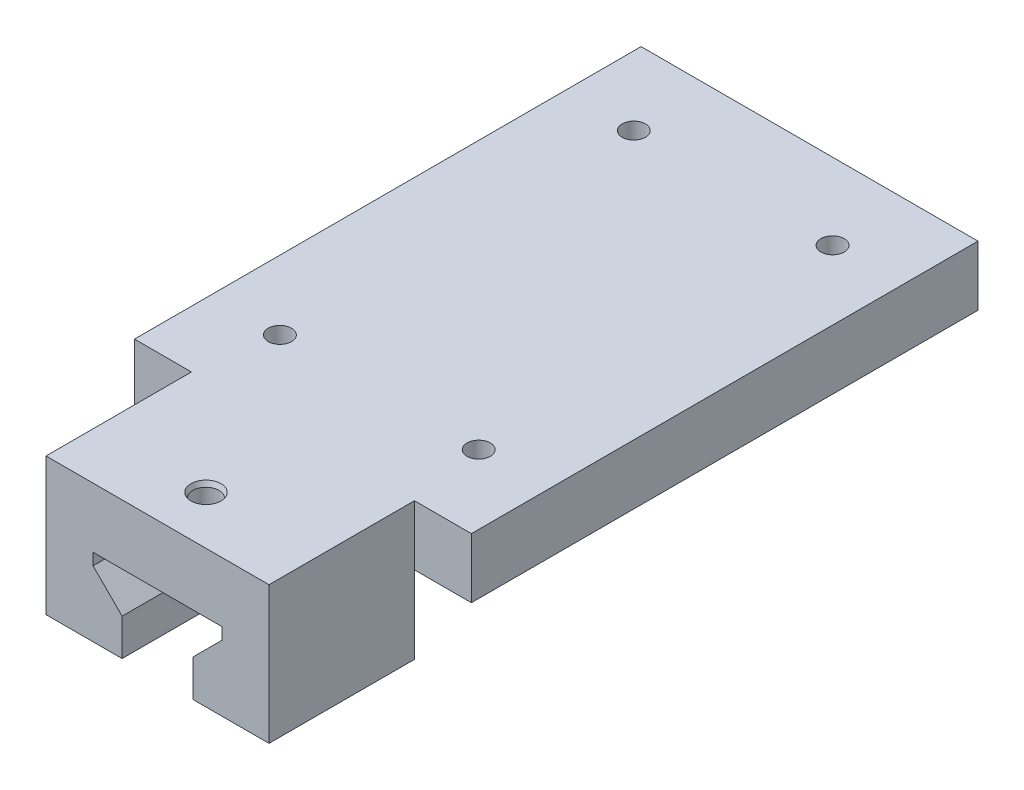
ISO-10303-21;
HEADER;
FILE_DESCRIPTION(('STEP AP214'),'2;1');
FILE_NAME('part.step','',(''),(''),'','','');
FILE_SCHEMA(('AUTOMOTIVE_DESIGN { 1 0 10303 214 1 1 1 1 }'));
ENDSEC;
DATA;
#1=APPLICATION_CONTEXT('core data for automotive mechanical design processes');
#2=APPLICATION_PROTOCOL_DEFINITION('international standard','automotive_design',2000,#1);
#3=PRODUCT_CONTEXT('',#1,'mechanical');
#4=PRODUCT('Part','Part','',(#3));
#5=PRODUCT_RELATED_PRODUCT_CATEGORY('part','',(#4));
#6=PRODUCT_DEFINITION_FORMATION('','',#4);
#7=PRODUCT_DEFINITION_CONTEXT('part definition',#1,'design');
#8=PRODUCT_DEFINITION('design','',#6,#7);
#9=PRODUCT_DEFINITION_SHAPE('','',#8);
#10=(LENGTH_UNIT() NAMED_UNIT(*) SI_UNIT(.MILLI.,.METRE.));
#11=(NAMED_UNIT(*) PLANE_ANGLE_UNIT() SI_UNIT($,.RADIAN.));
#12=(NAMED_UNIT(*) SI_UNIT($,.STERADIAN.) SOLID_ANGLE_UNIT());
#13=UNCERTAINTY_MEASURE_WITH_UNIT(LENGTH_MEASURE(1.E-05),#10,'distance_accuracy_value','');
#14=(GEOMETRIC_REPRESENTATION_CONTEXT(3) GLOBAL_UNCERTAINTY_ASSIGNED_CONTEXT((#13)) GLOBAL_UNIT_ASSIGNED_CONTEXT((#10,
#11,#12)) REPRESENTATION_CONTEXT('',''));
#15=CARTESIAN_POINT('',(0.,0.,0.));
#16=DIRECTION('',(0.,0.,1.));
#17=DIRECTION('',(1.,0.,0.));
#18=AXIS2_PLACEMENT_3D('',#15,#16,#17);
#19=CARTESIAN_POINT('',(0.,0.,0.));
#20=DIRECTION('',(0.,0.,1.));
#21=DIRECTION('',(1.,0.,0.));
#22=AXIS2_PLACEMENT_3D('',#19,#20,#21);
#23=PLANE('',#22);
#24=DIRECTION('',(-1.,0.,0.));
#25=VECTOR('',#24,1.);
#26=CARTESIAN_POINT('',(-34.75,16.3,0.));
#27=LINE('',#26,#25);
#28=CARTESIAN_POINT('',(23.,16.3,0.));
#29=VERTEX_POINT('',#28);
#30=CARTESIAN_POINT('',(13.3,16.3,0.));
#31=VERTEX_POINT('',#30);
#32=EDGE_CURVE('E11',#29,#31,#27,.T.);
#33=ORIENTED_EDGE('',*,*,#32,.F.);
#34=DIRECTION('',(0.,1.,0.));
#35=VECTOR('',#34,1.);
#36=CARTESIAN_POINT('',(23.,0.3,0.));
#37=LINE('',#36,#35);
#38=CARTESIAN_POINT('',(23.,0.3,0.));
#39=VERTEX_POINT('',#38);
#40=EDGE_CURVE('E197',#39,#29,#37,.T.);
#41=ORIENTED_EDGE('',*,*,#40,.F.);
#42=DIRECTION('',(1.,0.,0.));
#43=VECTOR('',#42,1.);
#44=CARTESIAN_POINT('',(7.3,0.3,0.));
#45=LINE('',#44,#43);
#46=CARTESIAN_POINT('',(7.3,0.3,0.));
#47=VERTEX_POINT('',#46);
#48=EDGE_CURVE('E195',#47,#39,#45,.T.);
#49=ORIENTED_EDGE('',*,*,#48,.F.);
#50=DIRECTION('',(0.,-1.,0.));
#51=VECTOR('',#50,1.);
#52=CARTESIAN_POINT('',(7.3,7.87573593128807,0.));
#53=LINE('',#52,#51);
#54=CARTESIAN_POINT('',(7.3,7.87573593128807,0.));
#55=VERTEX_POINT('',#54);
#56=EDGE_CURVE('E193',#55,#47,#53,.T.);
#57=ORIENTED_EDGE('',*,*,#56,.F.);
#58=DIRECTION('',(-0.707106781186548,-0.707106781186547,0.));
#59=VECTOR('',#58,1.);
#60=CARTESIAN_POINT('',(13.3,13.8757359312881,0.));
#61=LINE('',#60,#59);
#62=CARTESIAN_POINT('',(13.3,13.8757359312881,0.));
#63=VERTEX_POINT('',#62);
#64=EDGE_CURVE('E191',#63,#55,#61,.T.);
#65=ORIENTED_EDGE('',*,*,#64,.F.);
#66=DIRECTION('',(0.,-1.,0.));
#67=VECTOR('',#66,1.);
#68=CARTESIAN_POINT('',(13.3,16.3,0.));
#69=LINE('',#68,#67);
#70=EDGE_CURVE('E189',#31,#63,#69,.T.);
#71=ORIENTED_EDGE('',*,*,#70,.F.);
#72=EDGE_LOOP('',(#33,#41,#49,#57,#65,#71));
#73=FACE_BOUND('',#72,.T.);
#74=ADVANCED_FACE('F41',(#73),#23,.F.);
#75=CARTESIAN_POINT('',(-13.3,16.3,0.));
#76=VERTEX_POINT('',#75);
#77=CARTESIAN_POINT('',(-23.,16.3,0.));
#78=VERTEX_POINT('',#77);
#79=EDGE_CURVE('E51',#76,#78,#27,.T.);
#80=ORIENTED_EDGE('',*,*,#79,.F.);
#81=DIRECTION('',(0.,1.,0.));
#82=VECTOR('',#81,1.);
#83=CARTESIAN_POINT('',(-13.3,13.8757359312881,0.));
#84=LINE('',#83,#82);
#85=CARTESIAN_POINT('',(-13.3,13.8757359312881,0.));
#86=VERTEX_POINT('',#85);
#87=EDGE_CURVE('E186',#86,#76,#84,.T.);
#88=ORIENTED_EDGE('',*,*,#87,.F.);
#89=DIRECTION('',(-0.707106781186548,0.707106781186547,0.));
#90=VECTOR('',#89,1.);
#91=CARTESIAN_POINT('',(-7.3,7.87573593128807,0.));
#92=LINE('',#91,#90);
#93=CARTESIAN_POINT('',(-7.3,7.87573593128807,0.));
#94=VERTEX_POINT('',#93);
#95=EDGE_CURVE('E184',#94,#86,#92,.T.);
#96=ORIENTED_EDGE('',*,*,#95,.F.);
#97=DIRECTION('',(0.,1.,0.));
#98=VECTOR('',#97,1.);
#99=CARTESIAN_POINT('',(-7.3,0.3,0.));
#100=LINE('',#99,#98);
#101=CARTESIAN_POINT('',(-7.3,0.3,0.));
#102=VERTEX_POINT('',#101);
#103=EDGE_CURVE('E181',#102,#94,#100,.T.);
#104=ORIENTED_EDGE('',*,*,#103,.F.);
#105=DIRECTION('',(1.,0.,0.));
#106=VECTOR('',#105,1.);
#107=CARTESIAN_POINT('',(-23.,0.3,0.));
#108=LINE('',#107,#106);
#109=CARTESIAN_POINT('',(-23.,0.3,0.));
#110=VERTEX_POINT('',#109);
#111=EDGE_CURVE('E178',#110,#102,#108,.T.);
#112=ORIENTED_EDGE('',*,*,#111,.F.);
#113=DIRECTION('',(0.,-1.,0.));
#114=VECTOR('',#113,1.);
#115=CARTESIAN_POINT('',(-23.,28.65,0.));
#116=LINE('',#115,#114);
#117=EDGE_CURVE('E112',#78,#110,#116,.T.);
#118=ORIENTED_EDGE('',*,*,#117,.F.);
#119=EDGE_LOOP('',(#80,#88,#96,#104,#112,#118));
#120=FACE_BOUND('',#119,.T.);
#121=ADVANCED_FACE('F308',(#120),#23,.F.);
#122=CARTESIAN_POINT('',(-23.,0.3,30.));
#123=DIRECTION('',(0.,1.,0.));
#124=DIRECTION('',(0.,0.,1.));
#125=AXIS2_PLACEMENT_3D('',#122,#123,#124);
#126=PLANE('',#125);
#127=ORIENTED_EDGE('',*,*,#111,.T.);
#128=DIRECTION('',(0.,0.,-1.));
#129=VECTOR('',#128,1.);
#130=CARTESIAN_POINT('',(-7.3,0.3,30.));
#131=LINE('',#130,#129);
#132=CARTESIAN_POINT('',(-7.3,0.3,30.));
#133=VERTEX_POINT('',#132);
#134=EDGE_CURVE('E46',#133,#102,#131,.T.);
#135=ORIENTED_EDGE('',*,*,#134,.F.);
#136=DIRECTION('',(1.,0.,0.));
#137=VECTOR('',#136,1.);
#138=CARTESIAN_POINT('',(-23.,0.3,30.));
#139=LINE('',#138,#137);
#140=CARTESIAN_POINT('',(-23.,0.3,30.));
#141=VERTEX_POINT('',#140);
#142=EDGE_CURVE('E201',#141,#133,#139,.T.);
#143=ORIENTED_EDGE('',*,*,#142,.F.);
#144=DIRECTION('',(0.,0.,-1.));
#145=VECTOR('',#144,1.);
#146=CARTESIAN_POINT('',(-23.,0.3,30.));
#147=LINE('',#146,#145);
#148=EDGE_CURVE('E174',#141,#110,#147,.T.);
#149=ORIENTED_EDGE('',*,*,#148,.T.);
#150=EDGE_LOOP('',(#127,#135,#143,#149));
#151=FACE_BOUND('',#150,.T.);
#152=ADVANCED_FACE('F311',(#151),#126,.F.);
#153=CARTESIAN_POINT('',(-7.3,0.3,30.));
#154=DIRECTION('',(-1.,0.,0.));
#155=DIRECTION('',(0.,0.,1.));
#156=AXIS2_PLACEMENT_3D('',#153,#154,#155);
#157=PLANE('',#156);
#158=ORIENTED_EDGE('',*,*,#103,.T.);
#159=DIRECTION('',(0.,0.,-1.));
#160=VECTOR('',#159,1.);
#161=CARTESIAN_POINT('',(-7.3,7.87573593128807,30.));
#162=LINE('',#161,#160);
#163=CARTESIAN_POINT('',(-7.3,7.87573593128807,30.));
#164=VERTEX_POINT('',#163);
#165=EDGE_CURVE('E221',#164,#94,#162,.T.);
#166=ORIENTED_EDGE('',*,*,#165,.F.);
#167=DIRECTION('',(0.,1.,0.));
#168=VECTOR('',#167,1.);
#169=CARTESIAN_POINT('',(-7.3,0.3,30.));
#170=LINE('',#169,#168);
#171=EDGE_CURVE('E121',#133,#164,#170,.T.);
#172=ORIENTED_EDGE('',*,*,#171,.F.);
#173=ORIENTED_EDGE('',*,*,#134,.T.);
#174=EDGE_LOOP('',(#158,#166,#172,#173));
#175=FACE_BOUND('',#174,.T.);
#176=ADVANCED_FACE('F356',(#175),#157,.F.);
#177=CARTESIAN_POINT('',(-7.3,7.87573593128807,30.));
#178=DIRECTION('',(-0.707106781186547,-0.707106781186548,0.));
#179=DIRECTION('',(0.707106781186548,-0.707106781186547,0.));
#180=AXIS2_PLACEMENT_3D('',#177,#178,#179);
#181=PLANE('',#180);
#182=ORIENTED_EDGE('',*,*,#95,.T.);
#183=DIRECTION('',(0.,0.,-1.));
#184=VECTOR('',#183,1.);
#185=CARTESIAN_POINT('',(-13.3,13.8757359312881,30.));
#186=LINE('',#185,#184);
#187=CARTESIAN_POINT('',(-13.3,13.8757359312881,30.));
#188=VERTEX_POINT('',#187);
#189=EDGE_CURVE('E219',#188,#86,#186,.T.);
#190=ORIENTED_EDGE('',*,*,#189,.F.);
#191=DIRECTION('',(-0.707106781186548,0.707106781186547,0.));
#192=VECTOR('',#191,1.);
#193=CARTESIAN_POINT('',(-7.3,7.87573593128807,30.));
#194=LINE('',#193,#192);
#195=EDGE_CURVE('E314',#164,#188,#194,.T.);
#196=ORIENTED_EDGE('',*,*,#195,.F.);
#197=ORIENTED_EDGE('',*,*,#165,.T.);
#198=EDGE_LOOP('',(#182,#190,#196,#197));
#199=FACE_BOUND('',#198,.T.);
#200=ADVANCED_FACE('F354',(#199),#181,.F.);
#201=CARTESIAN_POINT('',(-13.3,13.8757359312881,30.));
#202=DIRECTION('',(-1.,0.,0.));
#203=DIRECTION('',(0.,0.,1.));
#204=AXIS2_PLACEMENT_3D('',#201,#202,#203);
#205=PLANE('',#204);
#206=ORIENTED_EDGE('',*,*,#87,.T.);
#207=DIRECTION('',(0.,0.,-1.));
#208=VECTOR('',#207,1.);
#209=CARTESIAN_POINT('',(-13.3,16.3,30.));
#210=LINE('',#209,#208);
#211=CARTESIAN_POINT('',(-13.3,16.3,30.));
#212=VERTEX_POINT('',#211);
#213=EDGE_CURVE('E216',#212,#76,#210,.T.);
#214=ORIENTED_EDGE('',*,*,#213,.F.);
#215=DIRECTION('',(0.,1.,0.));
#216=VECTOR('',#215,1.);
#217=CARTESIAN_POINT('',(-13.3,13.8757359312881,30.));
#218=LINE('',#217,#216);
#219=EDGE_CURVE('E320',#188,#212,#218,.T.);
#220=ORIENTED_EDGE('',*,*,#219,.F.);
#221=ORIENTED_EDGE('',*,*,#189,.T.);
#222=EDGE_LOOP('',(#206,#214,#220,#221));
#223=FACE_BOUND('',#222,.T.);
#224=ADVANCED_FACE('F353',(#223),#205,.F.);
#225=CARTESIAN_POINT('',(-13.3,16.3,30.));
#226=DIRECTION('',(0.,1.,0.));
#227=DIRECTION('',(0.,0.,1.));
#228=AXIS2_PLACEMENT_3D('',#225,#226,#227);
#229=PLANE('',#228);
#230=CARTESIAN_POINT('',(20.5,16.3,-88.75));
#231=DIRECTION('',(0.,-1.,0.));
#232=DIRECTION('',(0.,0.,-1.));
#233=AXIS2_PLACEMENT_3D('',#230,#231,#232);
#234=CIRCLE('',#233,4.);
#235=CARTESIAN_POINT('',(20.5,16.3,-92.75));
#236=VERTEX_POINT('',#235);
#237=EDGE_CURVE('E396',#236,#236,#234,.T.);
#238=ORIENTED_EDGE('',*,*,#237,.F.);
#239=EDGE_LOOP('',(#238));
#240=FACE_BOUND('',#239,.T.);
#241=CARTESIAN_POINT('',(-20.5,16.3,-88.75));
#242=DIRECTION('',(0.,-1.,0.));
#243=DIRECTION('',(0.,0.,-1.));
#244=AXIS2_PLACEMENT_3D('',#241,#242,#243);
#245=CIRCLE('',#244,4.);
#246=CARTESIAN_POINT('',(-20.5,16.3,-92.75));
#247=VERTEX_POINT('',#246);
#248=EDGE_CURVE('E400',#247,#247,#245,.T.);
#249=ORIENTED_EDGE('',*,*,#248,.F.);
#250=EDGE_LOOP('',(#249));
#251=FACE_BOUND('',#250,.T.);
#252=CARTESIAN_POINT('',(20.5,16.3,-15.75));
#253=DIRECTION('',(0.,-1.,0.));
#254=DIRECTION('',(0.,0.,-1.));
#255=AXIS2_PLACEMENT_3D('',#252,#253,#254);
#256=CIRCLE('',#255,4.);
#257=CARTESIAN_POINT('',(20.5,16.3,-19.75));
#258=VERTEX_POINT('',#257);
#259=EDGE_CURVE('E404',#258,#258,#256,.T.);
#260=ORIENTED_EDGE('',*,*,#259,.F.);
#261=EDGE_LOOP('',(#260));
#262=FACE_BOUND('',#261,.T.);
#263=CARTESIAN_POINT('',(-20.5,16.3,-15.75));
#264=DIRECTION('',(0.,-1.,0.));
#265=DIRECTION('',(0.,0.,-1.));
#266=AXIS2_PLACEMENT_3D('',#263,#264,#265);
#267=CIRCLE('',#266,4.);
#268=CARTESIAN_POINT('',(-20.5,16.3,-19.75));
#269=VERTEX_POINT('',#268);
#270=EDGE_CURVE('E408',#269,#269,#267,.T.);
#271=ORIENTED_EDGE('',*,*,#270,.F.);
#272=EDGE_LOOP('',(#271));
#273=FACE_BOUND('',#272,.T.);
#274=CARTESIAN_POINT('',(0.,16.3,20.));
#275=DIRECTION('',(0.,1.,0.));
#276=DIRECTION('',(0.,0.,1.));
#277=AXIS2_PLACEMENT_3D('',#274,#275,#276);
#278=CIRCLE('',#277,2.70000000000001);
#279=CARTESIAN_POINT('',(0.,16.3,22.7));
#280=VERTEX_POINT('',#279);
#281=EDGE_CURVE('E182',#280,#280,#278,.T.);
#282=ORIENTED_EDGE('',*,*,#281,.T.);
#283=EDGE_LOOP('',(#282));
#284=FACE_BOUND('',#283,.T.);
#285=ORIENTED_EDGE('',*,*,#213,.T.);
#286=ORIENTED_EDGE('',*,*,#79,.T.);
#287=CARTESIAN_POINT('',(-34.75,16.3,0.));
#288=VERTEX_POINT('',#287);
#289=EDGE_CURVE('E53',#78,#288,#27,.T.);
#290=ORIENTED_EDGE('',*,*,#289,.T.);
#291=DIRECTION('',(0.,0.,-1.));
#292=VECTOR('',#291,1.);
#293=CARTESIAN_POINT('',(-34.75,16.3,0.));
#294=LINE('',#293,#292);
#295=CARTESIAN_POINT('',(-34.75,16.3,-104.5));
#296=VERTEX_POINT('',#295);
#297=EDGE_CURVE('E239',#288,#296,#294,.T.);
#298=ORIENTED_EDGE('',*,*,#297,.T.);
#299=DIRECTION('',(1.,0.,0.));
#300=VECTOR('',#299,1.);
#301=CARTESIAN_POINT('',(-34.75,16.3,-104.5));
#302=LINE('',#301,#300);
#303=CARTESIAN_POINT('',(34.75,16.3,-104.5));
#304=VERTEX_POINT('',#303);
#305=EDGE_CURVE('E244',#296,#304,#302,.T.);
#306=ORIENTED_EDGE('',*,*,#305,.T.);
#307=DIRECTION('',(0.,0.,1.));
#308=VECTOR('',#307,1.);
#309=CARTESIAN_POINT('',(34.75,16.3,0.));
#310=LINE('',#309,#308);
#311=CARTESIAN_POINT('',(34.75,16.3,0.));
#312=VERTEX_POINT('',#311);
#313=EDGE_CURVE('E249',#304,#312,#310,.T.);
#314=ORIENTED_EDGE('',*,*,#313,.T.);
#315=EDGE_CURVE('E228',#312,#29,#27,.T.);
#316=ORIENTED_EDGE('',*,*,#315,.T.);
#317=ORIENTED_EDGE('',*,*,#32,.T.);
#318=DIRECTION('',(0.,0.,-1.));
#319=VECTOR('',#318,1.);
#320=CARTESIAN_POINT('',(13.3,16.3,30.));
#321=LINE('',#320,#319);
#322=CARTESIAN_POINT('',(13.3,16.3,30.));
#323=VERTEX_POINT('',#322);
#324=EDGE_CURVE('E214',#323,#31,#321,.T.);
#325=ORIENTED_EDGE('',*,*,#324,.F.);
#326=DIRECTION('',(1.,0.,0.));
#327=VECTOR('',#326,1.);
#328=CARTESIAN_POINT('',(-13.3,16.3,30.));
#329=LINE('',#328,#327);
#330=EDGE_CURVE('E322',#212,#323,#329,.T.);
#331=ORIENTED_EDGE('',*,*,#330,.F.);
#332=EDGE_LOOP('',(#285,#286,#290,#298,#306,#314,#316,#317,#325,#331));
#333=FACE_BOUND('',#332,.T.);
#334=ADVANCED_FACE('F348',(#240,#251,#262,#273,#284,#333),#229,.F.);
#335=CARTESIAN_POINT('',(13.3,16.3,30.));
#336=DIRECTION('',(1.,0.,0.));
#337=DIRECTION('',(0.,0.,-1.));
#338=AXIS2_PLACEMENT_3D('',#335,#336,#337);
#339=PLANE('',#338);
#340=ORIENTED_EDGE('',*,*,#70,.T.);
#341=DIRECTION('',(0.,0.,-1.));
#342=VECTOR('',#341,1.);
#343=CARTESIAN_POINT('',(13.3,13.8757359312881,30.));
#344=LINE('',#343,#342);
#345=CARTESIAN_POINT('',(13.3,13.8757359312881,30.));
#346=VERTEX_POINT('',#345);
#347=EDGE_CURVE('E211',#346,#63,#344,.T.);
#348=ORIENTED_EDGE('',*,*,#347,.F.);
#349=DIRECTION('',(0.,-1.,0.));
#350=VECTOR('',#349,1.);
#351=CARTESIAN_POINT('',(13.3,16.3,30.));
#352=LINE('',#351,#350);
#353=EDGE_CURVE('E324',#323,#346,#352,.T.);
#354=ORIENTED_EDGE('',*,*,#353,.F.);
#355=ORIENTED_EDGE('',*,*,#324,.T.);
#356=EDGE_LOOP('',(#340,#348,#354,#355));
#357=FACE_BOUND('',#356,.T.);
#358=ADVANCED_FACE('F345',(#357),#339,.F.);
#359=CARTESIAN_POINT('',(13.3,13.8757359312881,30.));
#360=DIRECTION('',(0.707106781186547,-0.707106781186548,0.));
#361=DIRECTION('',(0.707106781186548,0.707106781186547,0.));
#362=AXIS2_PLACEMENT_3D('',#359,#360,#361);
#363=PLANE('',#362);
#364=ORIENTED_EDGE('',*,*,#64,.T.);
#365=DIRECTION('',(0.,0.,-1.));
#366=VECTOR('',#365,1.);
#367=CARTESIAN_POINT('',(7.3,7.87573593128807,30.));
#368=LINE('',#367,#366);
#369=CARTESIAN_POINT('',(7.3,7.87573593128807,30.));
#370=VERTEX_POINT('',#369);
#371=EDGE_CURVE('E208',#370,#55,#368,.T.);
#372=ORIENTED_EDGE('',*,*,#371,.F.);
#373=DIRECTION('',(-0.707106781186548,-0.707106781186547,0.));
#374=VECTOR('',#373,1.);
#375=CARTESIAN_POINT('',(13.3,13.8757359312881,30.));
#376=LINE('',#375,#374);
#377=EDGE_CURVE('E326',#346,#370,#376,.T.);
#378=ORIENTED_EDGE('',*,*,#377,.F.);
#379=ORIENTED_EDGE('',*,*,#347,.T.);
#380=EDGE_LOOP('',(#364,#372,#378,#379));
#381=FACE_BOUND('',#380,.T.);
#382=ADVANCED_FACE('F341',(#381),#363,.F.);
#383=CARTESIAN_POINT('',(7.3,7.87573593128807,30.));
#384=DIRECTION('',(1.,0.,0.));
#385=DIRECTION('',(0.,1.,0.));
#386=AXIS2_PLACEMENT_3D('',#383,#384,#385);
#387=PLANE('',#386);
#388=ORIENTED_EDGE('',*,*,#56,.T.);
#389=DIRECTION('',(0.,0.,-1.));
#390=VECTOR('',#389,1.);
#391=CARTESIAN_POINT('',(7.3,0.3,30.));
#392=LINE('',#391,#390);
#393=CARTESIAN_POINT('',(7.3,0.3,30.));
#394=VERTEX_POINT('',#393);
#395=EDGE_CURVE('E205',#394,#47,#392,.T.);
#396=ORIENTED_EDGE('',*,*,#395,.F.);
#397=DIRECTION('',(0.,-1.,0.));
#398=VECTOR('',#397,1.);
#399=CARTESIAN_POINT('',(7.3,7.87573593128807,30.));
#400=LINE('',#399,#398);
#401=EDGE_CURVE('E328',#370,#394,#400,.T.);
#402=ORIENTED_EDGE('',*,*,#401,.F.);
#403=ORIENTED_EDGE('',*,*,#371,.T.);
#404=EDGE_LOOP('',(#388,#396,#402,#403));
#405=FACE_BOUND('',#404,.T.);
#406=ADVANCED_FACE('F334',(#405),#387,.F.);
#407=CARTESIAN_POINT('',(7.3,0.3,30.));
#408=DIRECTION('',(0.,1.,0.));
#409=DIRECTION('',(0.,0.,1.));
#410=AXIS2_PLACEMENT_3D('',#407,#408,#409);
#411=PLANE('',#410);
#412=ORIENTED_EDGE('',*,*,#48,.T.);
#413=DIRECTION('',(0.,0.,-1.));
#414=VECTOR('',#413,1.);
#415=CARTESIAN_POINT('',(23.,0.3,30.));
#416=LINE('',#415,#414);
#417=CARTESIAN_POINT('',(23.,0.3,30.));
#418=VERTEX_POINT('',#417);
#419=EDGE_CURVE('E168',#418,#39,#416,.T.);
#420=ORIENTED_EDGE('',*,*,#419,.F.);
#421=DIRECTION('',(1.,0.,0.));
#422=VECTOR('',#421,1.);
#423=CARTESIAN_POINT('',(7.3,0.3,30.));
#424=LINE('',#423,#422);
#425=EDGE_CURVE('E155',#394,#418,#424,.T.);
#426=ORIENTED_EDGE('',*,*,#425,.F.);
#427=ORIENTED_EDGE('',*,*,#395,.T.);
#428=EDGE_LOOP('',(#412,#420,#426,#427));
#429=FACE_BOUND('',#428,.T.);
#430=ADVANCED_FACE('F338',(#429),#411,.F.);
#431=CARTESIAN_POINT('',(23.,0.3,30.));
#432=DIRECTION('',(-1.,0.,0.));
#433=DIRECTION('',(0.,0.,1.));
#434=AXIS2_PLACEMENT_3D('',#431,#432,#433);
#435=PLANE('',#434);
#436=ORIENTED_EDGE('',*,*,#40,.T.);
#437=CARTESIAN_POINT('',(23.,28.65,0.));
#438=VERTEX_POINT('',#437);
#439=EDGE_CURVE('E164',#29,#438,#37,.T.);
#440=ORIENTED_EDGE('',*,*,#439,.T.);
#441=DIRECTION('',(0.,0.,-1.));
#442=VECTOR('',#441,1.);
#443=CARTESIAN_POINT('',(23.,28.65,30.));
#444=LINE('',#443,#442);
#445=CARTESIAN_POINT('',(23.,28.65,30.));
#446=VERTEX_POINT('',#445);
#447=EDGE_CURVE('E161',#446,#438,#444,.T.);
#448=ORIENTED_EDGE('',*,*,#447,.F.);
#449=DIRECTION('',(0.,1.,0.));
#450=VECTOR('',#449,1.);
#451=CARTESIAN_POINT('',(23.,0.3,30.));
#452=LINE('',#451,#450);
#453=EDGE_CURVE('E148',#418,#446,#452,.T.);
#454=ORIENTED_EDGE('',*,*,#453,.F.);
#455=ORIENTED_EDGE('',*,*,#419,.T.);
#456=EDGE_LOOP('',(#436,#440,#448,#454,#455));
#457=FACE_BOUND('',#456,.T.);
#458=ADVANCED_FACE('F162',(#457),#435,.F.);
#459=CARTESIAN_POINT('',(23.,28.65,30.));
#460=DIRECTION('',(0.,-1.,0.));
#461=DIRECTION('',(0.,0.,-1.));
#462=AXIS2_PLACEMENT_3D('',#459,#460,#461);
#463=PLANE('',#462);
#464=CARTESIAN_POINT('',(20.5,28.65,-88.75));
#465=DIRECTION('',(0.,-1.,0.));
#466=DIRECTION('',(0.,0.,-1.));
#467=AXIS2_PLACEMENT_3D('',#464,#465,#466);
#468=CIRCLE('',#467,2.4);
#469=CARTESIAN_POINT('',(20.5,28.65,-91.15));
#470=VERTEX_POINT('',#469);
#471=EDGE_CURVE('E495',#470,#470,#468,.T.);
#472=ORIENTED_EDGE('',*,*,#471,.T.);
#473=EDGE_LOOP('',(#472));
#474=FACE_BOUND('',#473,.T.);
#475=CARTESIAN_POINT('',(-20.5,28.65,-88.75));
#476=DIRECTION('',(0.,-1.,0.));
#477=DIRECTION('',(0.,0.,-1.));
#478=AXIS2_PLACEMENT_3D('',#475,#476,#477);
#479=CIRCLE('',#478,2.4);
#480=CARTESIAN_POINT('',(-20.5,28.65,-91.15));
#481=VERTEX_POINT('',#480);
#482=EDGE_CURVE('E505',#481,#481,#479,.T.);
#483=ORIENTED_EDGE('',*,*,#482,.T.);
#484=EDGE_LOOP('',(#483));
#485=FACE_BOUND('',#484,.T.);
#486=CARTESIAN_POINT('',(20.5,28.65,-15.75));
#487=DIRECTION('',(0.,-1.,0.));
#488=DIRECTION('',(0.,0.,-1.));
#489=AXIS2_PLACEMENT_3D('',#486,#487,#488);
#490=CIRCLE('',#489,2.4);
#491=CARTESIAN_POINT('',(20.5,28.65,-18.15));
#492=VERTEX_POINT('',#491);
#493=EDGE_CURVE('E515',#492,#492,#490,.T.);
#494=ORIENTED_EDGE('',*,*,#493,.T.);
#495=EDGE_LOOP('',(#494));
#496=FACE_BOUND('',#495,.T.);
#497=CARTESIAN_POINT('',(-20.5,28.65,-15.75));
#498=DIRECTION('',(0.,-1.,0.));
#499=DIRECTION('',(0.,0.,-1.));
#500=AXIS2_PLACEMENT_3D('',#497,#498,#499);
#501=CIRCLE('',#500,2.4);
#502=CARTESIAN_POINT('',(-20.5,28.65,-18.15));
#503=VERTEX_POINT('',#502);
#504=EDGE_CURVE('E257',#503,#503,#501,.T.);
#505=ORIENTED_EDGE('',*,*,#504,.T.);
#506=EDGE_LOOP('',(#505));
#507=FACE_BOUND('',#506,.T.);
#508=CARTESIAN_POINT('',(0.,28.65,20.));
#509=DIRECTION('',(0.,1.,0.));
#510=DIRECTION('',(0.,0.,1.));
#511=AXIS2_PLACEMENT_3D('',#508,#509,#510);
#512=CIRCLE('',#511,3.10000000000001);
#513=CARTESIAN_POINT('',(0.,28.65,23.1));
#514=VERTEX_POINT('',#513);
#515=EDGE_CURVE('E234',#514,#514,#512,.T.);
#516=ORIENTED_EDGE('',*,*,#515,.F.);
#517=EDGE_LOOP('',(#516));
#518=FACE_BOUND('',#517,.T.);
#519=ORIENTED_EDGE('',*,*,#447,.T.);
#520=DIRECTION('',(1.,0.,0.));
#521=VECTOR('',#520,1.);
#522=CARTESIAN_POINT('',(-34.75,28.65,0.));
#523=LINE('',#522,#521);
#524=CARTESIAN_POINT('',(34.75,28.65,0.));
#525=VERTEX_POINT('',#524);
#526=EDGE_CURVE('E256',#438,#525,#523,.T.);
#527=ORIENTED_EDGE('',*,*,#526,.T.);
#528=DIRECTION('',(0.,0.,-1.));
#529=VECTOR('',#528,1.);
#530=CARTESIAN_POINT('',(34.75,28.65,0.));
#531=LINE('',#530,#529);
#532=CARTESIAN_POINT('',(34.75,28.65,-104.5));
#533=VERTEX_POINT('',#532);
#534=EDGE_CURVE('E260',#525,#533,#531,.T.);
#535=ORIENTED_EDGE('',*,*,#534,.T.);
#536=DIRECTION('',(-1.,0.,0.));
#537=VECTOR('',#536,1.);
#538=CARTESIAN_POINT('',(-34.75,28.65,-104.5));
#539=LINE('',#538,#537);
#540=CARTESIAN_POINT('',(-34.75,28.65,-104.5));
#541=VERTEX_POINT('',#540);
#542=EDGE_CURVE('E263',#533,#541,#539,.T.);
#543=ORIENTED_EDGE('',*,*,#542,.T.);
#544=DIRECTION('',(0.,0.,1.));
#545=VECTOR('',#544,1.);
#546=CARTESIAN_POINT('',(-34.75,28.65,0.));
#547=LINE('',#546,#545);
#548=CARTESIAN_POINT('',(-34.75,28.65,0.));
#549=VERTEX_POINT('',#548);
#550=EDGE_CURVE('E253',#541,#549,#547,.T.);
#551=ORIENTED_EDGE('',*,*,#550,.T.);
#552=CARTESIAN_POINT('',(-23.,28.65,0.));
#553=VERTEX_POINT('',#552);
#554=EDGE_CURVE('E258',#549,#553,#523,.T.);
#555=ORIENTED_EDGE('',*,*,#554,.T.);
#556=DIRECTION('',(0.,0.,-1.));
#557=VECTOR('',#556,1.);
#558=CARTESIAN_POINT('',(-23.,28.65,30.));
#559=LINE('',#558,#557);
#560=CARTESIAN_POINT('',(-23.,28.65,30.));
#561=VERTEX_POINT('',#560);
#562=EDGE_CURVE('E169',#561,#553,#559,.T.);
#563=ORIENTED_EDGE('',*,*,#562,.F.);
#564=DIRECTION('',(-1.,0.,0.));
#565=VECTOR('',#564,1.);
#566=CARTESIAN_POINT('',(23.,28.65,30.));
#567=LINE('',#566,#565);
#568=EDGE_CURVE('E152',#446,#561,#567,.T.);
#569=ORIENTED_EDGE('',*,*,#568,.F.);
#570=EDGE_LOOP('',(#519,#527,#535,#543,#551,#555,#563,#569));
#571=FACE_BOUND('',#570,.T.);
#572=ADVANCED_FACE('F171',(#474,#485,#496,#507,#518,#571),#463,.F.);
#573=CARTESIAN_POINT('',(-23.,28.65,30.));
#574=DIRECTION('',(1.,0.,0.));
#575=DIRECTION('',(0.,1.,0.));
#576=AXIS2_PLACEMENT_3D('',#573,#574,#575);
#577=PLANE('',#576);
#578=EDGE_CURVE('E199',#553,#78,#116,.T.);
#579=ORIENTED_EDGE('',*,*,#578,.T.);
#580=ORIENTED_EDGE('',*,*,#117,.T.);
#581=ORIENTED_EDGE('',*,*,#148,.F.);
#582=DIRECTION('',(0.,-1.,0.));
#583=VECTOR('',#582,1.);
#584=CARTESIAN_POINT('',(-23.,28.65,30.));
#585=LINE('',#584,#583);
#586=EDGE_CURVE('E67',#561,#141,#585,.T.);
#587=ORIENTED_EDGE('',*,*,#586,.F.);
#588=ORIENTED_EDGE('',*,*,#562,.T.);
#589=EDGE_LOOP('',(#579,#580,#581,#587,#588));
#590=FACE_BOUND('',#589,.T.);
#591=ADVANCED_FACE('F305',(#590),#577,.F.);
#592=CARTESIAN_POINT('',(0.,0.,30.));
#593=DIRECTION('',(0.,0.,1.));
#594=DIRECTION('',(1.,0.,0.));
#595=AXIS2_PLACEMENT_3D('',#592,#593,#594);
#596=PLANE('',#595);
#597=ORIENTED_EDGE('',*,*,#142,.T.);
#598=ORIENTED_EDGE('',*,*,#171,.T.);
#599=ORIENTED_EDGE('',*,*,#195,.T.);
#600=ORIENTED_EDGE('',*,*,#219,.T.);
#601=ORIENTED_EDGE('',*,*,#330,.T.);
#602=ORIENTED_EDGE('',*,*,#353,.T.);
#603=ORIENTED_EDGE('',*,*,#377,.T.);
#604=ORIENTED_EDGE('',*,*,#401,.T.);
#605=ORIENTED_EDGE('',*,*,#425,.T.);
#606=ORIENTED_EDGE('',*,*,#453,.T.);
#607=ORIENTED_EDGE('',*,*,#568,.T.);
#608=ORIENTED_EDGE('',*,*,#586,.T.);
#609=EDGE_LOOP('',(#597,#598,#599,#600,#601,#602,#603,#604,#605,#606,#607,#608));
#610=FACE_BOUND('',#609,.T.);
#611=ADVANCED_FACE('F150',(#610),#596,.T.);
#612=CARTESIAN_POINT('',(0.,28.65,20.));
#613=DIRECTION('',(0.,1.,0.));
#614=DIRECTION('',(0.,0.,1.));
#615=AXIS2_PLACEMENT_3D('',#612,#613,#614);
#616=CYLINDRICAL_SURFACE('',#615,2.70000000000001);
#617=ORIENTED_EDGE('',*,*,#281,.F.);
#618=EDGE_LOOP('',(#617));
#619=FACE_BOUND('',#618,.T.);
#620=CARTESIAN_POINT('',(0.,27.65,20.));
#621=DIRECTION('',(0.,1.,0.));
#622=DIRECTION('',(0.,0.,1.));
#623=AXIS2_PLACEMENT_3D('',#620,#621,#622);
#624=CIRCLE('',#623,2.70000000000001);
#625=CARTESIAN_POINT('',(0.,27.65,22.7));
#626=VERTEX_POINT('',#625);
#627=EDGE_CURVE('E238',#626,#626,#624,.T.);
#628=ORIENTED_EDGE('',*,*,#627,.T.);
#629=EDGE_LOOP('',(#628));
#630=FACE_BOUND('',#629,.T.);
#631=ADVANCED_FACE('F415',(#619,#630),#616,.F.);
#632=CARTESIAN_POINT('',(0.,27.65,20.));
#633=DIRECTION('',(0.,1.,0.));
#634=DIRECTION('',(0.,0.,1.));
#635=AXIS2_PLACEMENT_3D('',#632,#633,#634);
#636=CONICAL_SURFACE('',#635,2.70000000000003,0.380506377112367);
#637=ORIENTED_EDGE('',*,*,#515,.T.);
#638=EDGE_LOOP('',(#637));
#639=FACE_BOUND('',#638,.T.);
#640=ORIENTED_EDGE('',*,*,#627,.F.);
#641=EDGE_LOOP('',(#640));
#642=FACE_BOUND('',#641,.T.);
#643=ADVANCED_FACE('F44',(#639,#642),#636,.F.);
#644=CARTESIAN_POINT('',(-34.75,-109.200996011984,0.));
#645=DIRECTION('',(0.,0.,1.));
#646=DIRECTION('',(1.,0.,0.));
#647=AXIS2_PLACEMENT_3D('',#644,#645,#646);
#648=PLANE('',#647);
#649=ORIENTED_EDGE('',*,*,#578,.F.);
#650=ORIENTED_EDGE('',*,*,#554,.F.);
#651=DIRECTION('',(0.,1.,0.));
#652=VECTOR('',#651,1.);
#653=CARTESIAN_POINT('',(-34.75,-109.200996011984,0.));
#654=LINE('',#653,#652);
#655=EDGE_CURVE('E266',#288,#549,#654,.T.);
#656=ORIENTED_EDGE('',*,*,#655,.F.);
#657=ORIENTED_EDGE('',*,*,#289,.F.);
#658=EDGE_LOOP('',(#649,#650,#656,#657));
#659=FACE_BOUND('',#658,.T.);
#660=ADVANCED_FACE('F288',(#659),#648,.T.);
#661=ORIENTED_EDGE('',*,*,#439,.F.);
#662=ORIENTED_EDGE('',*,*,#315,.F.);
#663=DIRECTION('',(0.,1.,0.));
#664=VECTOR('',#663,1.);
#665=CARTESIAN_POINT('',(34.75,-109.200996011984,0.));
#666=LINE('',#665,#664);
#667=EDGE_CURVE('E273',#312,#525,#666,.T.);
#668=ORIENTED_EDGE('',*,*,#667,.T.);
#669=ORIENTED_EDGE('',*,*,#526,.F.);
#670=EDGE_LOOP('',(#661,#662,#668,#669));
#671=FACE_BOUND('',#670,.T.);
#672=ADVANCED_FACE('F422',(#671),#648,.T.);
#673=CARTESIAN_POINT('',(-34.75,-109.200996011984,0.));
#674=DIRECTION('',(-1.,0.,0.));
#675=DIRECTION('',(0.,0.,1.));
#676=AXIS2_PLACEMENT_3D('',#673,#674,#675);
#677=PLANE('',#676);
#678=ORIENTED_EDGE('',*,*,#297,.F.);
#679=ORIENTED_EDGE('',*,*,#655,.T.);
#680=ORIENTED_EDGE('',*,*,#550,.F.);
#681=DIRECTION('',(0.,1.,0.));
#682=VECTOR('',#681,1.);
#683=CARTESIAN_POINT('',(-34.75,-109.200996011984,-104.5));
#684=LINE('',#683,#682);
#685=EDGE_CURVE('E267',#296,#541,#684,.T.);
#686=ORIENTED_EDGE('',*,*,#685,.F.);
#687=EDGE_LOOP('',(#678,#679,#680,#686));
#688=FACE_BOUND('',#687,.T.);
#689=ADVANCED_FACE('F281',(#688),#677,.T.);
#690=CARTESIAN_POINT('',(-34.75,-109.200996011984,-104.5));
#691=DIRECTION('',(0.,0.,-1.));
#692=DIRECTION('',(-1.,0.,0.));
#693=AXIS2_PLACEMENT_3D('',#690,#691,#692);
#694=PLANE('',#693);
#695=ORIENTED_EDGE('',*,*,#305,.F.);
#696=ORIENTED_EDGE('',*,*,#685,.T.);
#697=ORIENTED_EDGE('',*,*,#542,.F.);
#698=DIRECTION('',(0.,1.,0.));
#699=VECTOR('',#698,1.);
#700=CARTESIAN_POINT('',(34.75,-109.200996011984,-104.5));
#701=LINE('',#700,#699);
#702=EDGE_CURVE('E270',#304,#533,#701,.T.);
#703=ORIENTED_EDGE('',*,*,#702,.F.);
#704=EDGE_LOOP('',(#695,#696,#697,#703));
#705=FACE_BOUND('',#704,.T.);
#706=ADVANCED_FACE('F296',(#705),#694,.T.);
#707=CARTESIAN_POINT('',(34.75,-109.200996011984,0.));
#708=DIRECTION('',(1.,0.,0.));
#709=DIRECTION('',(0.,0.,-1.));
#710=AXIS2_PLACEMENT_3D('',#707,#708,#709);
#711=PLANE('',#710);
#712=ORIENTED_EDGE('',*,*,#313,.F.);
#713=ORIENTED_EDGE('',*,*,#702,.T.);
#714=ORIENTED_EDGE('',*,*,#534,.F.);
#715=ORIENTED_EDGE('',*,*,#667,.F.);
#716=EDGE_LOOP('',(#712,#713,#714,#715));
#717=FACE_BOUND('',#716,.T.);
#718=ADVANCED_FACE('F432',(#717),#711,.T.);
#719=CARTESIAN_POINT('',(-20.5,16.3,-15.75));
#720=DIRECTION('',(0.,-1.,0.));
#721=DIRECTION('',(0.,0.,-1.));
#722=AXIS2_PLACEMENT_3D('',#719,#720,#721);
#723=CYLINDRICAL_SURFACE('',#722,2.4);
#724=ORIENTED_EDGE('',*,*,#504,.F.);
#725=EDGE_LOOP('',(#724));
#726=FACE_BOUND('',#725,.T.);
#727=CARTESIAN_POINT('',(-20.5,20.3,-15.75));
#728=DIRECTION('',(0.,-1.,0.));
#729=DIRECTION('',(0.,0.,-1.));
#730=AXIS2_PLACEMENT_3D('',#727,#728,#729);
#731=CIRCLE('',#730,2.40000000000001);
#732=CARTESIAN_POINT('',(-20.5,20.3,-18.15));
#733=VERTEX_POINT('',#732);
#734=EDGE_CURVE('E522',#733,#733,#731,.T.);
#735=ORIENTED_EDGE('',*,*,#734,.T.);
#736=EDGE_LOOP('',(#735));
#737=FACE_BOUND('',#736,.T.);
#738=ADVANCED_FACE('F434',(#726,#737),#723,.F.);
#739=CARTESIAN_POINT('',(-18.1,20.3,-15.75));
#740=DIRECTION('',(0.,1.,0.));
#741=DIRECTION('',(0.,0.,1.));
#742=AXIS2_PLACEMENT_3D('',#739,#740,#741);
#743=PLANE('',#742);
#744=ORIENTED_EDGE('',*,*,#734,.F.);
#745=EDGE_LOOP('',(#744));
#746=FACE_BOUND('',#745,.T.);
#747=CARTESIAN_POINT('',(-20.5,20.3,-15.75));
#748=DIRECTION('',(0.,-1.,0.));
#749=DIRECTION('',(0.,0.,-1.));
#750=AXIS2_PLACEMENT_3D('',#747,#748,#749);
#751=CIRCLE('',#750,4.);
#752=CARTESIAN_POINT('',(-20.5,20.3,-19.75));
#753=VERTEX_POINT('',#752);
#754=EDGE_CURVE('E519',#753,#753,#751,.T.);
#755=ORIENTED_EDGE('',*,*,#754,.T.);
#756=EDGE_LOOP('',(#755));
#757=FACE_BOUND('',#756,.T.);
#758=ADVANCED_FACE('F439',(#746,#757),#743,.F.);
#759=CARTESIAN_POINT('',(-20.5,16.3,-15.75));
#760=DIRECTION('',(0.,-1.,0.));
#761=DIRECTION('',(0.,0.,-1.));
#762=AXIS2_PLACEMENT_3D('',#759,#760,#761);
#763=CYLINDRICAL_SURFACE('',#762,4.);
#764=ORIENTED_EDGE('',*,*,#754,.F.);
#765=EDGE_LOOP('',(#764));
#766=FACE_BOUND('',#765,.T.);
#767=ORIENTED_EDGE('',*,*,#270,.T.);
#768=EDGE_LOOP('',(#767));
#769=FACE_BOUND('',#768,.T.);
#770=ADVANCED_FACE('F443',(#766,#769),#763,.F.);
#771=CARTESIAN_POINT('',(20.5,16.3,-15.75));
#772=DIRECTION('',(0.,-1.,0.));
#773=DIRECTION('',(0.,0.,-1.));
#774=AXIS2_PLACEMENT_3D('',#771,#772,#773);
#775=CYLINDRICAL_SURFACE('',#774,2.4);
#776=ORIENTED_EDGE('',*,*,#493,.F.);
#777=EDGE_LOOP('',(#776));
#778=FACE_BOUND('',#777,.T.);
#779=CARTESIAN_POINT('',(20.5,20.3,-15.75));
#780=DIRECTION('',(0.,-1.,0.));
#781=DIRECTION('',(0.,0.,-1.));
#782=AXIS2_PLACEMENT_3D('',#779,#780,#781);
#783=CIRCLE('',#782,2.40000000000001);
#784=CARTESIAN_POINT('',(20.5,20.3,-18.15));
#785=VERTEX_POINT('',#784);
#786=EDGE_CURVE('E512',#785,#785,#783,.T.);
#787=ORIENTED_EDGE('',*,*,#786,.T.);
#788=EDGE_LOOP('',(#787));
#789=FACE_BOUND('',#788,.T.);
#790=ADVANCED_FACE('F447',(#778,#789),#775,.F.);
#791=CARTESIAN_POINT('',(22.9,20.3,-15.75));
#792=DIRECTION('',(0.,1.,0.));
#793=DIRECTION('',(0.,0.,1.));
#794=AXIS2_PLACEMENT_3D('',#791,#792,#793);
#795=PLANE('',#794);
#796=ORIENTED_EDGE('',*,*,#786,.F.);
#797=EDGE_LOOP('',(#796));
#798=FACE_BOUND('',#797,.T.);
#799=CARTESIAN_POINT('',(20.5,20.3,-15.75));
#800=DIRECTION('',(0.,-1.,0.));
#801=DIRECTION('',(0.,0.,-1.));
#802=AXIS2_PLACEMENT_3D('',#799,#800,#801);
#803=CIRCLE('',#802,4.);
#804=CARTESIAN_POINT('',(20.5,20.3,-19.75));
#805=VERTEX_POINT('',#804);
#806=EDGE_CURVE('E509',#805,#805,#803,.T.);
#807=ORIENTED_EDGE('',*,*,#806,.T.);
#808=EDGE_LOOP('',(#807));
#809=FACE_BOUND('',#808,.T.);
#810=ADVANCED_FACE('F451',(#798,#809),#795,.F.);
#811=CARTESIAN_POINT('',(20.5,16.3,-15.75));
#812=DIRECTION('',(0.,-1.,0.));
#813=DIRECTION('',(0.,0.,-1.));
#814=AXIS2_PLACEMENT_3D('',#811,#812,#813);
#815=CYLINDRICAL_SURFACE('',#814,4.);
#816=ORIENTED_EDGE('',*,*,#806,.F.);
#817=EDGE_LOOP('',(#816));
#818=FACE_BOUND('',#817,.T.);
#819=ORIENTED_EDGE('',*,*,#259,.T.);
#820=EDGE_LOOP('',(#819));
#821=FACE_BOUND('',#820,.T.);
#822=ADVANCED_FACE('F455',(#818,#821),#815,.F.);
#823=CARTESIAN_POINT('',(-20.5,16.3,-88.75));
#824=DIRECTION('',(0.,-1.,0.));
#825=DIRECTION('',(0.,0.,-1.));
#826=AXIS2_PLACEMENT_3D('',#823,#824,#825);
#827=CYLINDRICAL_SURFACE('',#826,2.4);
#828=ORIENTED_EDGE('',*,*,#482,.F.);
#829=EDGE_LOOP('',(#828));
#830=FACE_BOUND('',#829,.T.);
#831=CARTESIAN_POINT('',(-20.5,20.3,-88.75));
#832=DIRECTION('',(0.,-1.,0.));
#833=DIRECTION('',(0.,0.,-1.));
#834=AXIS2_PLACEMENT_3D('',#831,#832,#833);
#835=CIRCLE('',#834,2.40000000000001);
#836=CARTESIAN_POINT('',(-20.5,20.3,-91.15));
#837=VERTEX_POINT('',#836);
#838=EDGE_CURVE('E502',#837,#837,#835,.T.);
#839=ORIENTED_EDGE('',*,*,#838,.T.);
#840=EDGE_LOOP('',(#839));
#841=FACE_BOUND('',#840,.T.);
#842=ADVANCED_FACE('F459',(#830,#841),#827,.F.);
#843=CARTESIAN_POINT('',(-18.1,20.3,-88.75));
#844=DIRECTION('',(0.,1.,0.));
#845=DIRECTION('',(0.,0.,1.));
#846=AXIS2_PLACEMENT_3D('',#843,#844,#845);
#847=PLANE('',#846);
#848=ORIENTED_EDGE('',*,*,#838,.F.);
#849=EDGE_LOOP('',(#848));
#850=FACE_BOUND('',#849,.T.);
#851=CARTESIAN_POINT('',(-20.5,20.3,-88.75));
#852=DIRECTION('',(0.,-1.,0.));
#853=DIRECTION('',(0.,0.,-1.));
#854=AXIS2_PLACEMENT_3D('',#851,#852,#853);
#855=CIRCLE('',#854,4.);
#856=CARTESIAN_POINT('',(-20.5,20.3,-92.75));
#857=VERTEX_POINT('',#856);
#858=EDGE_CURVE('E499',#857,#857,#855,.T.);
#859=ORIENTED_EDGE('',*,*,#858,.T.);
#860=EDGE_LOOP('',(#859));
#861=FACE_BOUND('',#860,.T.);
#862=ADVANCED_FACE('F463',(#850,#861),#847,.F.);
#863=CARTESIAN_POINT('',(-20.5,16.3,-88.75));
#864=DIRECTION('',(0.,-1.,0.));
#865=DIRECTION('',(0.,0.,-1.));
#866=AXIS2_PLACEMENT_3D('',#863,#864,#865);
#867=CYLINDRICAL_SURFACE('',#866,4.);
#868=ORIENTED_EDGE('',*,*,#858,.F.);
#869=EDGE_LOOP('',(#868));
#870=FACE_BOUND('',#869,.T.);
#871=ORIENTED_EDGE('',*,*,#248,.T.);
#872=EDGE_LOOP('',(#871));
#873=FACE_BOUND('',#872,.T.);
#874=ADVANCED_FACE('F467',(#870,#873),#867,.F.);
#875=CARTESIAN_POINT('',(20.5,16.3,-88.75));
#876=DIRECTION('',(0.,-1.,0.));
#877=DIRECTION('',(0.,0.,-1.));
#878=AXIS2_PLACEMENT_3D('',#875,#876,#877);
#879=CYLINDRICAL_SURFACE('',#878,2.4);
#880=ORIENTED_EDGE('',*,*,#471,.F.);
#881=EDGE_LOOP('',(#880));
#882=FACE_BOUND('',#881,.T.);
#883=CARTESIAN_POINT('',(20.5,20.3,-88.75));
#884=DIRECTION('',(0.,-1.,0.));
#885=DIRECTION('',(0.,0.,-1.));
#886=AXIS2_PLACEMENT_3D('',#883,#884,#885);
#887=CIRCLE('',#886,2.40000000000001);
#888=CARTESIAN_POINT('',(20.5,20.3,-91.15));
#889=VERTEX_POINT('',#888);
#890=EDGE_CURVE('E490',#889,#889,#887,.T.);
#891=ORIENTED_EDGE('',*,*,#890,.T.);
#892=EDGE_LOOP('',(#891));
#893=FACE_BOUND('',#892,.T.);
#894=ADVANCED_FACE('F471',(#882,#893),#879,.F.);
#895=CARTESIAN_POINT('',(22.9,20.3,-88.75));
#896=DIRECTION('',(0.,1.,0.));
#897=DIRECTION('',(0.,0.,1.));
#898=AXIS2_PLACEMENT_3D('',#895,#896,#897);
#899=PLANE('',#898);
#900=ORIENTED_EDGE('',*,*,#890,.F.);
#901=EDGE_LOOP('',(#900));
#902=FACE_BOUND('',#901,.T.);
#903=CARTESIAN_POINT('',(20.5,20.3,-88.75));
#904=DIRECTION('',(0.,-1.,0.));
#905=DIRECTION('',(0.,0.,-1.));
#906=AXIS2_PLACEMENT_3D('',#903,#904,#905);
#907=CIRCLE('',#906,4.);
#908=CARTESIAN_POINT('',(20.5,20.3,-92.75));
#909=VERTEX_POINT('',#908);
#910=EDGE_CURVE('E488',#909,#909,#907,.T.);
#911=ORIENTED_EDGE('',*,*,#910,.T.);
#912=EDGE_LOOP('',(#911));
#913=FACE_BOUND('',#912,.T.);
#914=ADVANCED_FACE('F475',(#902,#913),#899,.F.);
#915=CARTESIAN_POINT('',(20.5,16.3,-88.75));
#916=DIRECTION('',(0.,-1.,0.));
#917=DIRECTION('',(0.,0.,-1.));
#918=AXIS2_PLACEMENT_3D('',#915,#916,#917);
#919=CYLINDRICAL_SURFACE('',#918,4.);
#920=ORIENTED_EDGE('',*,*,#910,.F.);
#921=EDGE_LOOP('',(#920));
#922=FACE_BOUND('',#921,.T.);
#923=ORIENTED_EDGE('',*,*,#237,.T.);
#924=EDGE_LOOP('',(#923));
#925=FACE_BOUND('',#924,.T.);
#926=ADVANCED_FACE('F479',(#922,#925),#919,.F.);
#927=CLOSED_SHELL('',(#74,#121,#152,#176,#200,#224,#334,#358,#382,#406,#430,#458,#572,#591,#611,
#631,#643,#660,#672,#689,#706,#718,#738,#758,#770,#790,#810,#822,#842,#862,#874,#894,#914,#926));
#928=MANIFOLD_SOLID_BREP('B2',#927);
#929=ADVANCED_BREP_SHAPE_REPRESENTATION('',(#18,#928),#14);
#930=SHAPE_DEFINITION_REPRESENTATION(#9,#929);
ENDSEC;
END-ISO-10303-21;
